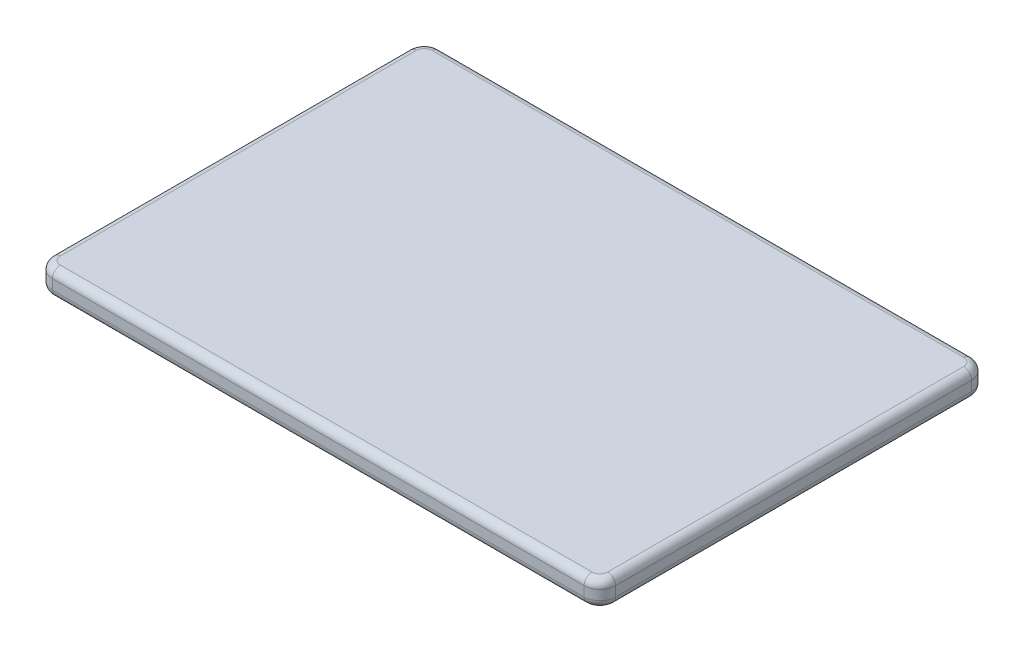
ISO-10303-21;
HEADER;
FILE_DESCRIPTION(('STEP AP214'),'2;1');
FILE_NAME('part.step','',(''),(''),'','','');
FILE_SCHEMA(('AUTOMOTIVE_DESIGN { 1 0 10303 214 1 1 1 1 }'));
ENDSEC;
DATA;
#1=APPLICATION_CONTEXT('core data for automotive mechanical design processes');
#2=APPLICATION_PROTOCOL_DEFINITION('international standard','automotive_design',2000,#1);
#3=PRODUCT_CONTEXT('',#1,'mechanical');
#4=PRODUCT('Part','Part','',(#3));
#5=PRODUCT_RELATED_PRODUCT_CATEGORY('part','',(#4));
#6=PRODUCT_DEFINITION_FORMATION('','',#4);
#7=PRODUCT_DEFINITION_CONTEXT('part definition',#1,'design');
#8=PRODUCT_DEFINITION('design','',#6,#7);
#9=PRODUCT_DEFINITION_SHAPE('','',#8);
#10=(LENGTH_UNIT() NAMED_UNIT(*) SI_UNIT(.MILLI.,.METRE.));
#11=(NAMED_UNIT(*) PLANE_ANGLE_UNIT() SI_UNIT($,.RADIAN.));
#12=(NAMED_UNIT(*) SI_UNIT($,.STERADIAN.) SOLID_ANGLE_UNIT());
#13=UNCERTAINTY_MEASURE_WITH_UNIT(LENGTH_MEASURE(1.E-05),#10,'distance_accuracy_value','');
#14=(GEOMETRIC_REPRESENTATION_CONTEXT(3) GLOBAL_UNCERTAINTY_ASSIGNED_CONTEXT((#13)) GLOBAL_UNIT_ASSIGNED_CONTEXT((#10,
#11,#12)) REPRESENTATION_CONTEXT('',''));
#15=CARTESIAN_POINT('',(0.,0.,0.));
#16=DIRECTION('',(0.,0.,1.));
#17=DIRECTION('',(1.,0.,0.));
#18=AXIS2_PLACEMENT_3D('',#15,#16,#17);
#19=CARTESIAN_POINT('',(1179.0888490581,16.256,-598.339961315777));
#20=DIRECTION('',(-1.,0.,0.));
#21=DIRECTION('',(0.,0.,1.));
#22=AXIS2_PLACEMENT_3D('',#19,#20,#21);
#23=PLANE('',#22);
#24=DIRECTION('',(0.,-1.,0.));
#25=VECTOR('',#24,1.);
#26=CARTESIAN_POINT('',(1179.0888490581,16.256,-608.339961315777));
#27=LINE('',#26,#25);
#28=CARTESIAN_POINT('',(1179.0888490581,11.256,-608.339961315777));
#29=VERTEX_POINT('',#28);
#30=CARTESIAN_POINT('',(1179.0888490581,5.,-608.339961315777));
#31=VERTEX_POINT('',#30);
#32=EDGE_CURVE('E290',#29,#31,#27,.T.);
#33=ORIENTED_EDGE('',*,*,#32,.T.);
#34=DIRECTION('',(0.,0.,-1.));
#35=VECTOR('',#34,1.);
#36=CARTESIAN_POINT('',(1179.0888490581,5.,-598.339961315777));
#37=LINE('',#36,#35);
#38=CARTESIAN_POINT('',(1179.0888490581,5.,-834.719961315777));
#39=VERTEX_POINT('',#38);
#40=EDGE_CURVE('E237',#31,#39,#37,.T.);
#41=ORIENTED_EDGE('',*,*,#40,.T.);
#42=DIRECTION('',(0.,-1.,0.));
#43=VECTOR('',#42,1.);
#44=CARTESIAN_POINT('',(1179.0888490581,16.256,-834.719961315777));
#45=LINE('',#44,#43);
#46=CARTESIAN_POINT('',(1179.0888490581,11.256,-834.719961315777));
#47=VERTEX_POINT('',#46);
#48=EDGE_CURVE('E217',#39,#47,#45,.F.);
#49=ORIENTED_EDGE('',*,*,#48,.T.);
#50=DIRECTION('',(0.,0.,-1.));
#51=VECTOR('',#50,1.);
#52=CARTESIAN_POINT('',(1179.0888490581,11.256,-608.339961315777));
#53=LINE('',#52,#51);
#54=EDGE_CURVE('E192',#47,#29,#53,.F.);
#55=ORIENTED_EDGE('',*,*,#54,.T.);
#56=EDGE_LOOP('',(#33,#41,#49,#55));
#57=FACE_BOUND('',#56,.T.);
#58=ADVANCED_FACE('F35',(#57),#23,.F.);
#59=CARTESIAN_POINT('',(1179.0888490581,16.256,-844.719961315777));
#60=DIRECTION('',(0.,0.,1.));
#61=DIRECTION('',(1.,0.,0.));
#62=AXIS2_PLACEMENT_3D('',#59,#60,#61);
#63=PLANE('',#62);
#64=DIRECTION('',(0.,-1.,0.));
#65=VECTOR('',#64,1.);
#66=CARTESIAN_POINT('',(1169.0888490581,16.256,-844.719961315777));
#67=LINE('',#66,#65);
#68=CARTESIAN_POINT('',(1169.0888490581,11.256,-844.719961315777));
#69=VERTEX_POINT('',#68);
#70=CARTESIAN_POINT('',(1169.0888490581,5.,-844.719961315777));
#71=VERTEX_POINT('',#70);
#72=EDGE_CURVE('E300',#69,#71,#67,.T.);
#73=ORIENTED_EDGE('',*,*,#72,.T.);
#74=DIRECTION('',(-1.,0.,0.));
#75=VECTOR('',#74,1.);
#76=CARTESIAN_POINT('',(1179.0888490581,5.,-844.719961315777));
#77=LINE('',#76,#75);
#78=CARTESIAN_POINT('',(830.948849058099,5.,-844.719961315777));
#79=VERTEX_POINT('',#78);
#80=EDGE_CURVE('E11',#71,#79,#77,.T.);
#81=ORIENTED_EDGE('',*,*,#80,.T.);
#82=DIRECTION('',(0.,-1.,0.));
#83=VECTOR('',#82,1.);
#84=CARTESIAN_POINT('',(830.948849058099,16.256,-844.719961315777));
#85=LINE('',#84,#83);
#86=CARTESIAN_POINT('',(830.948849058099,11.256,-844.719961315777));
#87=VERTEX_POINT('',#86);
#88=EDGE_CURVE('E170',#79,#87,#85,.F.);
#89=ORIENTED_EDGE('',*,*,#88,.T.);
#90=DIRECTION('',(-1.,0.,0.));
#91=VECTOR('',#90,1.);
#92=CARTESIAN_POINT('',(1169.0888490581,11.256,-844.719961315777));
#93=LINE('',#92,#91);
#94=EDGE_CURVE('E187',#87,#69,#93,.F.);
#95=ORIENTED_EDGE('',*,*,#94,.T.);
#96=EDGE_LOOP('',(#73,#81,#89,#95));
#97=FACE_BOUND('',#96,.T.);
#98=ADVANCED_FACE('F327',(#97),#63,.F.);
#99=CARTESIAN_POINT('',(820.948849058099,16.256,-598.339961315777));
#100=DIRECTION('',(1.,0.,0.));
#101=DIRECTION('',(0.,0.,-1.));
#102=AXIS2_PLACEMENT_3D('',#99,#100,#101);
#103=PLANE('',#102);
#104=DIRECTION('',(0.,-1.,0.));
#105=VECTOR('',#104,1.);
#106=CARTESIAN_POINT('',(820.948849058099,16.256,-834.719961315777));
#107=LINE('',#106,#105);
#108=CARTESIAN_POINT('',(820.948849058099,11.256,-834.719961315777));
#109=VERTEX_POINT('',#108);
#110=CARTESIAN_POINT('',(820.948849058099,5.,-834.719961315777));
#111=VERTEX_POINT('',#110);
#112=EDGE_CURVE('E292',#109,#111,#107,.T.);
#113=ORIENTED_EDGE('',*,*,#112,.T.);
#114=DIRECTION('',(0.,0.,1.));
#115=VECTOR('',#114,1.);
#116=CARTESIAN_POINT('',(820.948849058099,5.,-598.339961315777));
#117=LINE('',#116,#115);
#118=CARTESIAN_POINT('',(820.948849058099,5.,-608.339961315777));
#119=VERTEX_POINT('',#118);
#120=EDGE_CURVE('E245',#111,#119,#117,.T.);
#121=ORIENTED_EDGE('',*,*,#120,.T.);
#122=DIRECTION('',(0.,-1.,0.));
#123=VECTOR('',#122,1.);
#124=CARTESIAN_POINT('',(820.948849058099,16.256,-608.339961315777));
#125=LINE('',#124,#123);
#126=CARTESIAN_POINT('',(820.948849058099,11.256,-608.339961315777));
#127=VERTEX_POINT('',#126);
#128=EDGE_CURVE('E285',#119,#127,#125,.F.);
#129=ORIENTED_EDGE('',*,*,#128,.T.);
#130=DIRECTION('',(0.,0.,1.));
#131=VECTOR('',#130,1.);
#132=CARTESIAN_POINT('',(820.948849058099,11.256,-834.719961315777));
#133=LINE('',#132,#131);
#134=EDGE_CURVE('E177',#127,#109,#133,.F.);
#135=ORIENTED_EDGE('',*,*,#134,.T.);
#136=EDGE_LOOP('',(#113,#121,#129,#135));
#137=FACE_BOUND('',#136,.T.);
#138=ADVANCED_FACE('F320',(#137),#103,.F.);
#139=CARTESIAN_POINT('',(1179.0888490581,16.256,-598.339961315777));
#140=DIRECTION('',(0.,0.,-1.));
#141=DIRECTION('',(-1.,0.,0.));
#142=AXIS2_PLACEMENT_3D('',#139,#140,#141);
#143=PLANE('',#142);
#144=DIRECTION('',(0.,-1.,0.));
#145=VECTOR('',#144,1.);
#146=CARTESIAN_POINT('',(830.948849058099,16.256,-598.339961315777));
#147=LINE('',#146,#145);
#148=CARTESIAN_POINT('',(830.948849058099,11.256,-598.339961315777));
#149=VERTEX_POINT('',#148);
#150=CARTESIAN_POINT('',(830.948849058099,5.,-598.339961315777));
#151=VERTEX_POINT('',#150);
#152=EDGE_CURVE('E284',#149,#151,#147,.T.);
#153=ORIENTED_EDGE('',*,*,#152,.T.);
#154=DIRECTION('',(1.,0.,0.));
#155=VECTOR('',#154,1.);
#156=CARTESIAN_POINT('',(1179.0888490581,5.,-598.339961315777));
#157=LINE('',#156,#155);
#158=CARTESIAN_POINT('',(1169.0888490581,5.,-598.339961315777));
#159=VERTEX_POINT('',#158);
#160=EDGE_CURVE('E241',#151,#159,#157,.T.);
#161=ORIENTED_EDGE('',*,*,#160,.T.);
#162=DIRECTION('',(0.,-1.,0.));
#163=VECTOR('',#162,1.);
#164=CARTESIAN_POINT('',(1169.0888490581,16.256,-598.339961315777));
#165=LINE('',#164,#163);
#166=CARTESIAN_POINT('',(1169.0888490581,11.256,-598.339961315777));
#167=VERTEX_POINT('',#166);
#168=EDGE_CURVE('E289',#159,#167,#165,.F.);
#169=ORIENTED_EDGE('',*,*,#168,.T.);
#170=DIRECTION('',(1.,0.,0.));
#171=VECTOR('',#170,1.);
#172=CARTESIAN_POINT('',(830.948849058099,11.256,-598.339961315777));
#173=LINE('',#172,#171);
#174=EDGE_CURVE('E197',#167,#149,#173,.F.);
#175=ORIENTED_EDGE('',*,*,#174,.T.);
#176=EDGE_LOOP('',(#153,#161,#169,#175));
#177=FACE_BOUND('',#176,.T.);
#178=ADVANCED_FACE('F287',(#177),#143,.F.);
#179=CARTESIAN_POINT('',(0.,16.256,0.));
#180=DIRECTION('',(0.,1.,0.));
#181=DIRECTION('',(0.,0.,1.));
#182=AXIS2_PLACEMENT_3D('',#179,#180,#181);
#183=PLANE('',#182);
#184=DIRECTION('',(0.,0.,1.));
#185=VECTOR('',#184,1.);
#186=CARTESIAN_POINT('',(825.948849058099,16.256,-608.339961315777));
#187=LINE('',#186,#185);
#188=CARTESIAN_POINT('',(825.948849058099,16.256,-834.719961315777));
#189=VERTEX_POINT('',#188);
#190=CARTESIAN_POINT('',(825.948849058099,16.256,-608.339961315777));
#191=VERTEX_POINT('',#190);
#192=EDGE_CURVE('E174',#189,#191,#187,.T.);
#193=ORIENTED_EDGE('',*,*,#192,.T.);
#194=CARTESIAN_POINT('',(830.948849058099,16.256,-608.339961315777));
#195=DIRECTION('',(0.,1.,0.));
#196=DIRECTION('',(0.,0.,1.));
#197=AXIS2_PLACEMENT_3D('',#194,#195,#196);
#198=CIRCLE('',#197,5.);
#199=CARTESIAN_POINT('',(830.948849058099,16.256,-603.339961315777));
#200=VERTEX_POINT('',#199);
#201=EDGE_CURVE('E155',#191,#200,#198,.T.);
#202=ORIENTED_EDGE('',*,*,#201,.T.);
#203=DIRECTION('',(1.,0.,0.));
#204=VECTOR('',#203,1.);
#205=CARTESIAN_POINT('',(1169.0888490581,16.256,-603.339961315777));
#206=LINE('',#205,#204);
#207=CARTESIAN_POINT('',(1169.0888490581,16.256,-603.339961315777));
#208=VERTEX_POINT('',#207);
#209=EDGE_CURVE('E163',#200,#208,#206,.T.);
#210=ORIENTED_EDGE('',*,*,#209,.T.);
#211=CARTESIAN_POINT('',(1169.0888490581,16.256,-608.339961315777));
#212=DIRECTION('',(0.,1.,0.));
#213=DIRECTION('',(0.,0.,1.));
#214=AXIS2_PLACEMENT_3D('',#211,#212,#213);
#215=CIRCLE('',#214,5.);
#216=CARTESIAN_POINT('',(1174.0888490581,16.256,-608.339961315777));
#217=VERTEX_POINT('',#216);
#218=EDGE_CURVE('E169',#208,#217,#215,.T.);
#219=ORIENTED_EDGE('',*,*,#218,.T.);
#220=DIRECTION('',(0.,0.,-1.));
#221=VECTOR('',#220,1.);
#222=CARTESIAN_POINT('',(1174.0888490581,16.256,-834.719961315777));
#223=LINE('',#222,#221);
#224=CARTESIAN_POINT('',(1174.0888490581,16.256,-834.719961315777));
#225=VERTEX_POINT('',#224);
#226=EDGE_CURVE('E304',#217,#225,#223,.T.);
#227=ORIENTED_EDGE('',*,*,#226,.T.);
#228=CARTESIAN_POINT('',(1169.0888490581,16.256,-834.719961315777));
#229=DIRECTION('',(0.,1.,0.));
#230=DIRECTION('',(0.,0.,1.));
#231=AXIS2_PLACEMENT_3D('',#228,#229,#230);
#232=CIRCLE('',#231,5.);
#233=CARTESIAN_POINT('',(1169.0888490581,16.256,-839.719961315777));
#234=VERTEX_POINT('',#233);
#235=EDGE_CURVE('E306',#225,#234,#232,.T.);
#236=ORIENTED_EDGE('',*,*,#235,.T.);
#237=DIRECTION('',(-1.,0.,0.));
#238=VECTOR('',#237,1.);
#239=CARTESIAN_POINT('',(830.948849058099,16.256,-839.719961315777));
#240=LINE('',#239,#238);
#241=CARTESIAN_POINT('',(830.948849058099,16.256,-839.719961315777));
#242=VERTEX_POINT('',#241);
#243=EDGE_CURVE('E308',#234,#242,#240,.T.);
#244=ORIENTED_EDGE('',*,*,#243,.T.);
#245=CARTESIAN_POINT('',(830.948849058099,16.256,-834.719961315777));
#246=DIRECTION('',(0.,1.,0.));
#247=DIRECTION('',(0.,0.,1.));
#248=AXIS2_PLACEMENT_3D('',#245,#246,#247);
#249=CIRCLE('',#248,5.);
#250=EDGE_CURVE('E179',#242,#189,#249,.T.);
#251=ORIENTED_EDGE('',*,*,#250,.T.);
#252=EDGE_LOOP('',(#193,#202,#210,#219,#227,#236,#244,#251));
#253=FACE_BOUND('',#252,.T.);
#254=ADVANCED_FACE('F172',(#253),#183,.T.);
#255=CARTESIAN_POINT('',(0.,0.,0.));
#256=DIRECTION('',(0.,1.,0.));
#257=DIRECTION('',(0.,0.,1.));
#258=AXIS2_PLACEMENT_3D('',#255,#256,#257);
#259=PLANE('',#258);
#260=DIRECTION('',(-1.,0.,0.));
#261=VECTOR('',#260,1.);
#262=CARTESIAN_POINT('',(0.,0.,-839.719961315777));
#263=LINE('',#262,#261);
#264=CARTESIAN_POINT('',(830.948849058099,0.,-839.719961315777));
#265=VERTEX_POINT('',#264);
#266=CARTESIAN_POINT('',(1169.0888490581,0.,-839.719961315777));
#267=VERTEX_POINT('',#266);
#268=EDGE_CURVE('E198',#265,#267,#263,.F.);
#269=ORIENTED_EDGE('',*,*,#268,.T.);
#270=CARTESIAN_POINT('',(1169.0888490581,0.,-834.719961315777));
#271=DIRECTION('',(0.,1.,0.));
#272=DIRECTION('',(0.,0.,1.));
#273=AXIS2_PLACEMENT_3D('',#270,#271,#272);
#274=CIRCLE('',#273,5.);
#275=CARTESIAN_POINT('',(1174.0888490581,0.,-834.719961315777));
#276=VERTEX_POINT('',#275);
#277=EDGE_CURVE('E231',#267,#276,#274,.F.);
#278=ORIENTED_EDGE('',*,*,#277,.T.);
#279=DIRECTION('',(0.,0.,-1.));
#280=VECTOR('',#279,1.);
#281=CARTESIAN_POINT('',(1174.0888490581,0.,0.));
#282=LINE('',#281,#280);
#283=CARTESIAN_POINT('',(1174.0888490581,0.,-608.339961315777));
#284=VERTEX_POINT('',#283);
#285=EDGE_CURVE('E229',#276,#284,#282,.F.);
#286=ORIENTED_EDGE('',*,*,#285,.T.);
#287=CARTESIAN_POINT('',(1169.0888490581,0.,-608.339961315777));
#288=DIRECTION('',(0.,1.,0.));
#289=DIRECTION('',(0.,0.,1.));
#290=AXIS2_PLACEMENT_3D('',#287,#288,#289);
#291=CIRCLE('',#290,5.);
#292=CARTESIAN_POINT('',(1169.0888490581,0.,-603.339961315777));
#293=VERTEX_POINT('',#292);
#294=EDGE_CURVE('E227',#284,#293,#291,.F.);
#295=ORIENTED_EDGE('',*,*,#294,.T.);
#296=DIRECTION('',(1.,0.,0.));
#297=VECTOR('',#296,1.);
#298=CARTESIAN_POINT('',(0.,0.,-603.339961315777));
#299=LINE('',#298,#297);
#300=CARTESIAN_POINT('',(830.948849058099,0.,-603.339961315777));
#301=VERTEX_POINT('',#300);
#302=EDGE_CURVE('E225',#293,#301,#299,.F.);
#303=ORIENTED_EDGE('',*,*,#302,.T.);
#304=CARTESIAN_POINT('',(830.948849058099,0.,-608.339961315777));
#305=DIRECTION('',(0.,1.,0.));
#306=DIRECTION('',(0.,0.,1.));
#307=AXIS2_PLACEMENT_3D('',#304,#305,#306);
#308=CIRCLE('',#307,5.);
#309=CARTESIAN_POINT('',(825.948849058099,0.,-608.339961315777));
#310=VERTEX_POINT('',#309);
#311=EDGE_CURVE('E223',#301,#310,#308,.F.);
#312=ORIENTED_EDGE('',*,*,#311,.T.);
#313=DIRECTION('',(0.,0.,1.));
#314=VECTOR('',#313,1.);
#315=CARTESIAN_POINT('',(825.948849058099,0.,3.72184198955658E-13));
#316=LINE('',#315,#314);
#317=CARTESIAN_POINT('',(825.948849058099,0.,-834.719961315777));
#318=VERTEX_POINT('',#317);
#319=EDGE_CURVE('E221',#310,#318,#316,.F.);
#320=ORIENTED_EDGE('',*,*,#319,.T.);
#321=CARTESIAN_POINT('',(830.948849058099,0.,-834.719961315777));
#322=DIRECTION('',(0.,1.,0.));
#323=DIRECTION('',(0.,0.,1.));
#324=AXIS2_PLACEMENT_3D('',#321,#322,#323);
#325=CIRCLE('',#324,5.);
#326=EDGE_CURVE('E219',#318,#265,#325,.F.);
#327=ORIENTED_EDGE('',*,*,#326,.T.);
#328=EDGE_LOOP('',(#269,#278,#286,#295,#303,#312,#320,#327));
#329=FACE_BOUND('',#328,.T.);
#330=ADVANCED_FACE('F370',(#329),#259,.F.);
#331=CARTESIAN_POINT('',(1169.0888490581,16.256,-608.339961315777));
#332=DIRECTION('',(0.,-1.,0.));
#333=DIRECTION('',(0.,0.,-1.));
#334=AXIS2_PLACEMENT_3D('',#331,#332,#333);
#335=CYLINDRICAL_SURFACE('',#334,10.);
#336=ORIENTED_EDGE('',*,*,#168,.F.);
#337=CARTESIAN_POINT('',(1169.0888490581,5.,-608.339961315777));
#338=DIRECTION('',(0.,1.,0.));
#339=DIRECTION('',(0.,0.,1.));
#340=AXIS2_PLACEMENT_3D('',#337,#338,#339);
#341=CIRCLE('',#340,10.);
#342=EDGE_CURVE('E239',#159,#31,#341,.T.);
#343=ORIENTED_EDGE('',*,*,#342,.T.);
#344=ORIENTED_EDGE('',*,*,#32,.F.);
#345=CARTESIAN_POINT('',(1169.0888490581,11.256,-608.339961315777));
#346=DIRECTION('',(0.,1.,0.));
#347=DIRECTION('',(0.,0.,1.));
#348=AXIS2_PLACEMENT_3D('',#345,#346,#347);
#349=CIRCLE('',#348,10.);
#350=EDGE_CURVE('E194',#29,#167,#349,.F.);
#351=ORIENTED_EDGE('',*,*,#350,.T.);
#352=EDGE_LOOP('',(#336,#343,#344,#351));
#353=FACE_BOUND('',#352,.T.);
#354=ADVANCED_FACE('F347',(#353),#335,.T.);
#355=CARTESIAN_POINT('',(830.948849058099,16.256,-608.339961315777));
#356=DIRECTION('',(0.,-1.,0.));
#357=DIRECTION('',(0.,0.,-1.));
#358=AXIS2_PLACEMENT_3D('',#355,#356,#357);
#359=CYLINDRICAL_SURFACE('',#358,10.);
#360=ORIENTED_EDGE('',*,*,#128,.F.);
#361=CARTESIAN_POINT('',(830.948849058099,5.,-608.339961315777));
#362=DIRECTION('',(0.,1.,0.));
#363=DIRECTION('',(0.,0.,1.));
#364=AXIS2_PLACEMENT_3D('',#361,#362,#363);
#365=CIRCLE('',#364,10.);
#366=EDGE_CURVE('E243',#119,#151,#365,.T.);
#367=ORIENTED_EDGE('',*,*,#366,.T.);
#368=ORIENTED_EDGE('',*,*,#152,.F.);
#369=CARTESIAN_POINT('',(830.948849058099,11.256,-608.339961315777));
#370=DIRECTION('',(0.,1.,0.));
#371=DIRECTION('',(0.,0.,1.));
#372=AXIS2_PLACEMENT_3D('',#369,#370,#371);
#373=CIRCLE('',#372,10.);
#374=EDGE_CURVE('E157',#149,#127,#373,.F.);
#375=ORIENTED_EDGE('',*,*,#374,.T.);
#376=EDGE_LOOP('',(#360,#367,#368,#375));
#377=FACE_BOUND('',#376,.T.);
#378=ADVANCED_FACE('F283',(#377),#359,.T.);
#379=CARTESIAN_POINT('',(830.948849058099,16.256,-834.719961315777));
#380=DIRECTION('',(0.,-1.,0.));
#381=DIRECTION('',(0.,0.,-1.));
#382=AXIS2_PLACEMENT_3D('',#379,#380,#381);
#383=CYLINDRICAL_SURFACE('',#382,10.);
#384=ORIENTED_EDGE('',*,*,#88,.F.);
#385=CARTESIAN_POINT('',(830.948849058099,5.,-834.719961315777));
#386=DIRECTION('',(0.,1.,0.));
#387=DIRECTION('',(0.,0.,1.));
#388=AXIS2_PLACEMENT_3D('',#385,#386,#387);
#389=CIRCLE('',#388,10.);
#390=EDGE_CURVE('E44',#79,#111,#389,.T.);
#391=ORIENTED_EDGE('',*,*,#390,.T.);
#392=ORIENTED_EDGE('',*,*,#112,.F.);
#393=CARTESIAN_POINT('',(830.948849058099,11.256,-834.719961315777));
#394=DIRECTION('',(0.,1.,0.));
#395=DIRECTION('',(0.,0.,1.));
#396=AXIS2_PLACEMENT_3D('',#393,#394,#395);
#397=CIRCLE('',#396,10.);
#398=EDGE_CURVE('E184',#109,#87,#397,.F.);
#399=ORIENTED_EDGE('',*,*,#398,.T.);
#400=EDGE_LOOP('',(#384,#391,#392,#399));
#401=FACE_BOUND('',#400,.T.);
#402=ADVANCED_FACE('F321',(#401),#383,.T.);
#403=CARTESIAN_POINT('',(1169.0888490581,16.256,-834.719961315777));
#404=DIRECTION('',(0.,-1.,0.));
#405=DIRECTION('',(0.,0.,-1.));
#406=AXIS2_PLACEMENT_3D('',#403,#404,#405);
#407=CYLINDRICAL_SURFACE('',#406,10.);
#408=ORIENTED_EDGE('',*,*,#48,.F.);
#409=CARTESIAN_POINT('',(1169.0888490581,5.,-834.719961315777));
#410=DIRECTION('',(0.,1.,0.));
#411=DIRECTION('',(0.,0.,1.));
#412=AXIS2_PLACEMENT_3D('',#409,#410,#411);
#413=CIRCLE('',#412,10.);
#414=EDGE_CURVE('E234',#39,#71,#413,.T.);
#415=ORIENTED_EDGE('',*,*,#414,.T.);
#416=ORIENTED_EDGE('',*,*,#72,.F.);
#417=CARTESIAN_POINT('',(1169.0888490581,11.256,-834.719961315777));
#418=DIRECTION('',(0.,1.,0.));
#419=DIRECTION('',(0.,0.,1.));
#420=AXIS2_PLACEMENT_3D('',#417,#418,#419);
#421=CIRCLE('',#420,10.);
#422=EDGE_CURVE('E189',#69,#47,#421,.F.);
#423=ORIENTED_EDGE('',*,*,#422,.T.);
#424=EDGE_LOOP('',(#408,#415,#416,#423));
#425=FACE_BOUND('',#424,.T.);
#426=ADVANCED_FACE('F331',(#425),#407,.T.);
#427=CARTESIAN_POINT('',(1169.0888490581,11.256,-834.719961315777));
#428=DIRECTION('',(0.,1.,0.));
#429=DIRECTION('',(0.,0.,1.));
#430=AXIS2_PLACEMENT_3D('',#427,#428,#429);
#431=DEGENERATE_TOROIDAL_SURFACE('',#430,5.,5.,.T.);
#432=CARTESIAN_POINT('',(1174.0888490581,11.256,-834.719961315777));
#433=DIRECTION('',(0.,0.,1.));
#434=DIRECTION('',(1.,0.,0.));
#435=AXIS2_PLACEMENT_3D('',#432,#433,#434);
#436=CIRCLE('',#435,5.);
#437=EDGE_CURVE('E211',#47,#225,#436,.T.);
#438=ORIENTED_EDGE('',*,*,#437,.F.);
#439=ORIENTED_EDGE('',*,*,#422,.F.);
#440=CARTESIAN_POINT('',(1169.0888490581,11.256,-839.719961315777));
#441=DIRECTION('',(-1.,0.,0.));
#442=DIRECTION('',(0.,0.,1.));
#443=AXIS2_PLACEMENT_3D('',#440,#441,#442);
#444=CIRCLE('',#443,5.);
#445=EDGE_CURVE('E214',#234,#69,#444,.T.);
#446=ORIENTED_EDGE('',*,*,#445,.F.);
#447=ORIENTED_EDGE('',*,*,#235,.F.);
#448=EDGE_LOOP('',(#438,#439,#446,#447));
#449=FACE_BOUND('',#448,.T.);
#450=ADVANCED_FACE('F335',(#449),#431,.T.);
#451=CARTESIAN_POINT('',(0.,11.256,-839.719961315777));
#452=DIRECTION('',(1.,0.,0.));
#453=DIRECTION('',(0.,0.,-1.));
#454=AXIS2_PLACEMENT_3D('',#451,#452,#453);
#455=CYLINDRICAL_SURFACE('',#454,5.);
#456=ORIENTED_EDGE('',*,*,#445,.T.);
#457=ORIENTED_EDGE('',*,*,#94,.F.);
#458=CARTESIAN_POINT('',(830.948849058099,11.256,-839.719961315777));
#459=DIRECTION('',(-1.,0.,0.));
#460=DIRECTION('',(0.,0.,1.));
#461=AXIS2_PLACEMENT_3D('',#458,#459,#460);
#462=CIRCLE('',#461,5.);
#463=EDGE_CURVE('E208',#242,#87,#462,.T.);
#464=ORIENTED_EDGE('',*,*,#463,.F.);
#465=ORIENTED_EDGE('',*,*,#243,.F.);
#466=EDGE_LOOP('',(#456,#457,#464,#465));
#467=FACE_BOUND('',#466,.T.);
#468=ADVANCED_FACE('F324',(#467),#455,.T.);
#469=CARTESIAN_POINT('',(1174.0888490581,11.256,0.));
#470=DIRECTION('',(0.,0.,1.));
#471=DIRECTION('',(1.,0.,0.));
#472=AXIS2_PLACEMENT_3D('',#469,#470,#471);
#473=CYLINDRICAL_SURFACE('',#472,5.);
#474=ORIENTED_EDGE('',*,*,#437,.T.);
#475=ORIENTED_EDGE('',*,*,#226,.F.);
#476=CARTESIAN_POINT('',(1174.0888490581,11.256,-608.339961315777));
#477=DIRECTION('',(0.,0.,1.));
#478=DIRECTION('',(1.,0.,0.));
#479=AXIS2_PLACEMENT_3D('',#476,#477,#478);
#480=CIRCLE('',#479,5.);
#481=EDGE_CURVE('E205',#29,#217,#480,.T.);
#482=ORIENTED_EDGE('',*,*,#481,.F.);
#483=ORIENTED_EDGE('',*,*,#54,.F.);
#484=EDGE_LOOP('',(#474,#475,#482,#483));
#485=FACE_BOUND('',#484,.T.);
#486=ADVANCED_FACE('F341',(#485),#473,.T.);
#487=CARTESIAN_POINT('',(830.948849058099,11.256,-834.719961315777));
#488=DIRECTION('',(0.,1.,0.));
#489=DIRECTION('',(0.,0.,1.));
#490=AXIS2_PLACEMENT_3D('',#487,#488,#489);
#491=DEGENERATE_TOROIDAL_SURFACE('',#490,5.,5.,.T.);
#492=ORIENTED_EDGE('',*,*,#463,.T.);
#493=ORIENTED_EDGE('',*,*,#398,.F.);
#494=CARTESIAN_POINT('',(825.948849058099,11.256,-834.719961315777));
#495=DIRECTION('',(0.,0.,1.));
#496=DIRECTION('',(1.,0.,0.));
#497=AXIS2_PLACEMENT_3D('',#494,#495,#496);
#498=CIRCLE('',#497,5.);
#499=EDGE_CURVE('E202',#189,#109,#498,.T.);
#500=ORIENTED_EDGE('',*,*,#499,.F.);
#501=ORIENTED_EDGE('',*,*,#250,.F.);
#502=EDGE_LOOP('',(#492,#493,#500,#501));
#503=FACE_BOUND('',#502,.T.);
#504=ADVANCED_FACE('F315',(#503),#491,.T.);
#505=CARTESIAN_POINT('',(1169.0888490581,11.256,-608.339961315777));
#506=DIRECTION('',(0.,1.,0.));
#507=DIRECTION('',(0.,0.,1.));
#508=AXIS2_PLACEMENT_3D('',#505,#506,#507);
#509=DEGENERATE_TOROIDAL_SURFACE('',#508,5.,5.,.T.);
#510=ORIENTED_EDGE('',*,*,#481,.T.);
#511=ORIENTED_EDGE('',*,*,#218,.F.);
#512=CARTESIAN_POINT('',(1169.0888490581,11.256,-603.339961315777));
#513=DIRECTION('',(-1.,0.,0.));
#514=DIRECTION('',(0.,0.,1.));
#515=AXIS2_PLACEMENT_3D('',#512,#513,#514);
#516=CIRCLE('',#515,5.);
#517=EDGE_CURVE('E166',#167,#208,#516,.T.);
#518=ORIENTED_EDGE('',*,*,#517,.F.);
#519=ORIENTED_EDGE('',*,*,#350,.F.);
#520=EDGE_LOOP('',(#510,#511,#518,#519));
#521=FACE_BOUND('',#520,.T.);
#522=ADVANCED_FACE('F401',(#521),#509,.T.);
#523=CARTESIAN_POINT('',(825.948849058099,11.256,3.72184198955658E-13));
#524=DIRECTION('',(0.,0.,-1.));
#525=DIRECTION('',(-1.,0.,0.));
#526=AXIS2_PLACEMENT_3D('',#523,#524,#525);
#527=CYLINDRICAL_SURFACE('',#526,5.);
#528=ORIENTED_EDGE('',*,*,#499,.T.);
#529=ORIENTED_EDGE('',*,*,#134,.F.);
#530=CARTESIAN_POINT('',(825.948849058099,11.256,-608.339961315777));
#531=DIRECTION('',(0.,0.,1.));
#532=DIRECTION('',(1.,0.,0.));
#533=AXIS2_PLACEMENT_3D('',#530,#531,#532);
#534=CIRCLE('',#533,5.);
#535=EDGE_CURVE('E160',#191,#127,#534,.T.);
#536=ORIENTED_EDGE('',*,*,#535,.F.);
#537=ORIENTED_EDGE('',*,*,#192,.F.);
#538=EDGE_LOOP('',(#528,#529,#536,#537));
#539=FACE_BOUND('',#538,.T.);
#540=ADVANCED_FACE('F318',(#539),#527,.T.);
#541=CARTESIAN_POINT('',(0.,11.256,-603.339961315777));
#542=DIRECTION('',(-1.,0.,0.));
#543=DIRECTION('',(0.,0.,1.));
#544=AXIS2_PLACEMENT_3D('',#541,#542,#543);
#545=CYLINDRICAL_SURFACE('',#544,5.);
#546=ORIENTED_EDGE('',*,*,#517,.T.);
#547=ORIENTED_EDGE('',*,*,#209,.F.);
#548=CARTESIAN_POINT('',(830.948849058099,11.256,-603.339961315777));
#549=DIRECTION('',(-1.,0.,0.));
#550=DIRECTION('',(0.,0.,1.));
#551=AXIS2_PLACEMENT_3D('',#548,#549,#550);
#552=CIRCLE('',#551,5.);
#553=EDGE_CURVE('E150',#149,#200,#552,.T.);
#554=ORIENTED_EDGE('',*,*,#553,.F.);
#555=ORIENTED_EDGE('',*,*,#174,.F.);
#556=EDGE_LOOP('',(#546,#547,#554,#555));
#557=FACE_BOUND('',#556,.T.);
#558=ADVANCED_FACE('F164',(#557),#545,.T.);
#559=CARTESIAN_POINT('',(830.948849058099,11.256,-608.339961315777));
#560=DIRECTION('',(0.,1.,0.));
#561=DIRECTION('',(0.,0.,1.));
#562=AXIS2_PLACEMENT_3D('',#559,#560,#561);
#563=DEGENERATE_TOROIDAL_SURFACE('',#562,5.,5.,.T.);
#564=ORIENTED_EDGE('',*,*,#535,.T.);
#565=ORIENTED_EDGE('',*,*,#374,.F.);
#566=ORIENTED_EDGE('',*,*,#553,.T.);
#567=ORIENTED_EDGE('',*,*,#201,.F.);
#568=EDGE_LOOP('',(#564,#565,#566,#567));
#569=FACE_BOUND('',#568,.T.);
#570=ADVANCED_FACE('F153',(#569),#563,.T.);
#571=CARTESIAN_POINT('',(830.948849058099,5.,-608.339961315777));
#572=DIRECTION('',(0.,1.,0.));
#573=DIRECTION('',(0.,0.,1.));
#574=AXIS2_PLACEMENT_3D('',#571,#572,#573);
#575=DEGENERATE_TOROIDAL_SURFACE('',#574,5.,5.,.T.);
#576=CARTESIAN_POINT('',(830.948849058099,5.,-603.339961315777));
#577=DIRECTION('',(1.,0.,0.));
#578=DIRECTION('',(0.,0.,-1.));
#579=AXIS2_PLACEMENT_3D('',#576,#577,#578);
#580=CIRCLE('',#579,5.);
#581=EDGE_CURVE('E263',#151,#301,#580,.T.);
#582=ORIENTED_EDGE('',*,*,#581,.F.);
#583=ORIENTED_EDGE('',*,*,#366,.F.);
#584=CARTESIAN_POINT('',(825.948849058099,5.,-608.339961315777));
#585=DIRECTION('',(0.,0.,-1.));
#586=DIRECTION('',(-1.,0.,0.));
#587=AXIS2_PLACEMENT_3D('',#584,#585,#586);
#588=CIRCLE('',#587,5.);
#589=EDGE_CURVE('E39',#310,#119,#588,.T.);
#590=ORIENTED_EDGE('',*,*,#589,.F.);
#591=ORIENTED_EDGE('',*,*,#311,.F.);
#592=EDGE_LOOP('',(#582,#583,#590,#591));
#593=FACE_BOUND('',#592,.T.);
#594=ADVANCED_FACE('F37',(#593),#575,.T.);
#595=CARTESIAN_POINT('',(825.948849058099,5.,-598.339961315777));
#596=DIRECTION('',(0.,0.,1.));
#597=DIRECTION('',(1.,0.,0.));
#598=AXIS2_PLACEMENT_3D('',#595,#596,#597);
#599=CYLINDRICAL_SURFACE('',#598,5.);
#600=ORIENTED_EDGE('',*,*,#589,.T.);
#601=ORIENTED_EDGE('',*,*,#120,.F.);
#602=CARTESIAN_POINT('',(825.948849058099,5.,-834.719961315777));
#603=DIRECTION('',(0.,0.,-1.));
#604=DIRECTION('',(-1.,0.,0.));
#605=AXIS2_PLACEMENT_3D('',#602,#603,#604);
#606=CIRCLE('',#605,5.);
#607=EDGE_CURVE('E261',#318,#111,#606,.T.);
#608=ORIENTED_EDGE('',*,*,#607,.F.);
#609=ORIENTED_EDGE('',*,*,#319,.F.);
#610=EDGE_LOOP('',(#600,#601,#608,#609));
#611=FACE_BOUND('',#610,.T.);
#612=ADVANCED_FACE('F274',(#611),#599,.T.);
#613=CARTESIAN_POINT('',(1179.0888490581,5.,-603.339961315777));
#614=DIRECTION('',(1.,0.,0.));
#615=DIRECTION('',(0.,0.,-1.));
#616=AXIS2_PLACEMENT_3D('',#613,#614,#615);
#617=CYLINDRICAL_SURFACE('',#616,5.);
#618=ORIENTED_EDGE('',*,*,#581,.T.);
#619=ORIENTED_EDGE('',*,*,#302,.F.);
#620=CARTESIAN_POINT('',(1169.0888490581,5.,-603.339961315777));
#621=DIRECTION('',(1.,0.,0.));
#622=DIRECTION('',(0.,0.,-1.));
#623=AXIS2_PLACEMENT_3D('',#620,#621,#622);
#624=CIRCLE('',#623,5.);
#625=EDGE_CURVE('E258',#159,#293,#624,.T.);
#626=ORIENTED_EDGE('',*,*,#625,.F.);
#627=ORIENTED_EDGE('',*,*,#160,.F.);
#628=EDGE_LOOP('',(#618,#619,#626,#627));
#629=FACE_BOUND('',#628,.T.);
#630=ADVANCED_FACE('F371',(#629),#617,.T.);
#631=CARTESIAN_POINT('',(830.948849058099,5.,-834.719961315777));
#632=DIRECTION('',(0.,1.,0.));
#633=DIRECTION('',(0.,0.,1.));
#634=AXIS2_PLACEMENT_3D('',#631,#632,#633);
#635=DEGENERATE_TOROIDAL_SURFACE('',#634,5.,5.,.T.);
#636=ORIENTED_EDGE('',*,*,#607,.T.);
#637=ORIENTED_EDGE('',*,*,#390,.F.);
#638=CARTESIAN_POINT('',(830.948849058099,5.,-839.719961315777));
#639=DIRECTION('',(1.,0.,0.));
#640=DIRECTION('',(0.,0.,-1.));
#641=AXIS2_PLACEMENT_3D('',#638,#639,#640);
#642=CIRCLE('',#641,5.);
#643=EDGE_CURVE('E255',#265,#79,#642,.T.);
#644=ORIENTED_EDGE('',*,*,#643,.F.);
#645=ORIENTED_EDGE('',*,*,#326,.F.);
#646=EDGE_LOOP('',(#636,#637,#644,#645));
#647=FACE_BOUND('',#646,.T.);
#648=ADVANCED_FACE('F368',(#647),#635,.T.);
#649=CARTESIAN_POINT('',(1169.0888490581,5.,-608.339961315777));
#650=DIRECTION('',(0.,1.,0.));
#651=DIRECTION('',(0.,0.,1.));
#652=AXIS2_PLACEMENT_3D('',#649,#650,#651);
#653=DEGENERATE_TOROIDAL_SURFACE('',#652,5.,5.,.T.);
#654=ORIENTED_EDGE('',*,*,#625,.T.);
#655=ORIENTED_EDGE('',*,*,#294,.F.);
#656=CARTESIAN_POINT('',(1174.0888490581,5.,-608.339961315777));
#657=DIRECTION('',(0.,0.,-1.));
#658=DIRECTION('',(-1.,0.,0.));
#659=AXIS2_PLACEMENT_3D('',#656,#657,#658);
#660=CIRCLE('',#659,5.);
#661=EDGE_CURVE('E252',#31,#284,#660,.T.);
#662=ORIENTED_EDGE('',*,*,#661,.F.);
#663=ORIENTED_EDGE('',*,*,#342,.F.);
#664=EDGE_LOOP('',(#654,#655,#662,#663));
#665=FACE_BOUND('',#664,.T.);
#666=ADVANCED_FACE('F351',(#665),#653,.T.);
#667=CARTESIAN_POINT('',(1179.0888490581,5.,-839.719961315777));
#668=DIRECTION('',(-1.,0.,0.));
#669=DIRECTION('',(0.,0.,1.));
#670=AXIS2_PLACEMENT_3D('',#667,#668,#669);
#671=CYLINDRICAL_SURFACE('',#670,5.);
#672=ORIENTED_EDGE('',*,*,#643,.T.);
#673=ORIENTED_EDGE('',*,*,#80,.F.);
#674=CARTESIAN_POINT('',(1169.0888490581,5.,-839.719961315777));
#675=DIRECTION('',(1.,0.,0.));
#676=DIRECTION('',(0.,0.,-1.));
#677=AXIS2_PLACEMENT_3D('',#674,#675,#676);
#678=CIRCLE('',#677,5.);
#679=EDGE_CURVE('E250',#267,#71,#678,.T.);
#680=ORIENTED_EDGE('',*,*,#679,.F.);
#681=ORIENTED_EDGE('',*,*,#268,.F.);
#682=EDGE_LOOP('',(#672,#673,#680,#681));
#683=FACE_BOUND('',#682,.T.);
#684=ADVANCED_FACE('F364',(#683),#671,.T.);
#685=CARTESIAN_POINT('',(1174.0888490581,5.,-598.339961315777));
#686=DIRECTION('',(0.,0.,-1.));
#687=DIRECTION('',(-1.,0.,0.));
#688=AXIS2_PLACEMENT_3D('',#685,#686,#687);
#689=CYLINDRICAL_SURFACE('',#688,5.);
#690=ORIENTED_EDGE('',*,*,#661,.T.);
#691=ORIENTED_EDGE('',*,*,#285,.F.);
#692=CARTESIAN_POINT('',(1174.0888490581,5.,-834.719961315777));
#693=DIRECTION('',(0.,0.,-1.));
#694=DIRECTION('',(-1.,0.,0.));
#695=AXIS2_PLACEMENT_3D('',#692,#693,#694);
#696=CIRCLE('',#695,5.);
#697=EDGE_CURVE('E248',#39,#276,#696,.T.);
#698=ORIENTED_EDGE('',*,*,#697,.F.);
#699=ORIENTED_EDGE('',*,*,#40,.F.);
#700=EDGE_LOOP('',(#690,#691,#698,#699));
#701=FACE_BOUND('',#700,.T.);
#702=ADVANCED_FACE('F357',(#701),#689,.T.);
#703=CARTESIAN_POINT('',(1169.0888490581,5.,-834.719961315777));
#704=DIRECTION('',(0.,1.,0.));
#705=DIRECTION('',(0.,0.,1.));
#706=AXIS2_PLACEMENT_3D('',#703,#704,#705);
#707=DEGENERATE_TOROIDAL_SURFACE('',#706,5.,5.,.T.);
#708=ORIENTED_EDGE('',*,*,#679,.T.);
#709=ORIENTED_EDGE('',*,*,#414,.F.);
#710=ORIENTED_EDGE('',*,*,#697,.T.);
#711=ORIENTED_EDGE('',*,*,#277,.F.);
#712=EDGE_LOOP('',(#708,#709,#710,#711));
#713=FACE_BOUND('',#712,.T.);
#714=ADVANCED_FACE('F359',(#713),#707,.T.);
#715=CLOSED_SHELL('',(#58,#98,#138,#178,#254,#330,#354,#378,#402,#426,#450,#468,#486,#504,#522,
#540,#558,#570,#594,#612,#630,#648,#666,#684,#702,#714));
#716=MANIFOLD_SOLID_BREP('B2',#715);
#717=ADVANCED_BREP_SHAPE_REPRESENTATION('',(#18,#716),#14);
#718=SHAPE_DEFINITION_REPRESENTATION(#9,#717);
ENDSEC;
END-ISO-10303-21;
